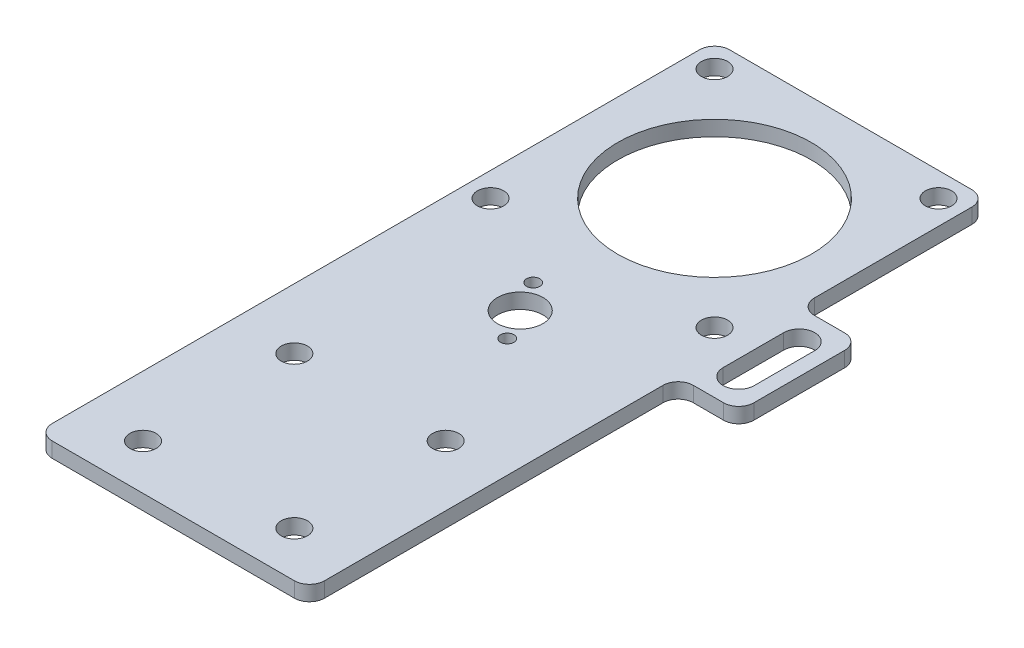
ISO-10303-21;
HEADER;
FILE_DESCRIPTION(('STEP AP214'),'2;1');
FILE_NAME('part.step','',(''),(''),'','','');
FILE_SCHEMA(('AUTOMOTIVE_DESIGN { 1 0 10303 214 1 1 1 1 }'));
ENDSEC;
DATA;
#1=APPLICATION_CONTEXT('core data for automotive mechanical design processes');
#2=APPLICATION_PROTOCOL_DEFINITION('international standard','automotive_design',2000,#1);
#3=PRODUCT_CONTEXT('',#1,'mechanical');
#4=PRODUCT('Part','Part','',(#3));
#5=PRODUCT_RELATED_PRODUCT_CATEGORY('part','',(#4));
#6=PRODUCT_DEFINITION_FORMATION('','',#4);
#7=PRODUCT_DEFINITION_CONTEXT('part definition',#1,'design');
#8=PRODUCT_DEFINITION('design','',#6,#7);
#9=PRODUCT_DEFINITION_SHAPE('','',#8);
#10=(LENGTH_UNIT() NAMED_UNIT(*) SI_UNIT(.MILLI.,.METRE.));
#11=(NAMED_UNIT(*) PLANE_ANGLE_UNIT() SI_UNIT($,.RADIAN.));
#12=(NAMED_UNIT(*) SI_UNIT($,.STERADIAN.) SOLID_ANGLE_UNIT());
#13=UNCERTAINTY_MEASURE_WITH_UNIT(LENGTH_MEASURE(1.E-05),#10,'distance_accuracy_value','');
#14=(GEOMETRIC_REPRESENTATION_CONTEXT(3) GLOBAL_UNCERTAINTY_ASSIGNED_CONTEXT((#13)) GLOBAL_UNIT_ASSIGNED_CONTEXT((#10,
#11,#12)) REPRESENTATION_CONTEXT('',''));
#15=CARTESIAN_POINT('',(0.,0.,0.));
#16=DIRECTION('',(0.,0.,1.));
#17=DIRECTION('',(1.,0.,0.));
#18=AXIS2_PLACEMENT_3D('',#15,#16,#17);
#19=CARTESIAN_POINT('',(28.575,-3.17500000000005,-25.1681958439345));
#20=DIRECTION('',(-1.,0.,0.));
#21=DIRECTION('',(0.,1.,0.));
#22=AXIS2_PLACEMENT_3D('',#19,#20,#21);
#23=PLANE('',#22);
#24=DIRECTION('',(0.,0.,-1.));
#25=VECTOR('',#24,1.);
#26=CARTESIAN_POINT('',(28.575,0.,-25.1681958439345));
#27=LINE('',#26,#25);
#28=CARTESIAN_POINT('',(28.575,-6.38378239159465E-13,-110.393195843935));
#29=VERTEX_POINT('',#28);
#30=CARTESIAN_POINT('',(28.575,-4.09394740330526E-13,-77.3681958439346));
#31=VERTEX_POINT('',#30);
#32=EDGE_CURVE('E215',#29,#31,#27,.F.);
#33=ORIENTED_EDGE('',*,*,#32,.T.);
#34=DIRECTION('',(0.,1.,0.));
#35=VECTOR('',#34,1.);
#36=CARTESIAN_POINT('',(28.575,-3.17500000000041,-77.3681958439345));
#37=LINE('',#36,#35);
#38=CARTESIAN_POINT('',(28.575,-3.17500000000041,-77.3681958439345));
#39=VERTEX_POINT('',#38);
#40=EDGE_CURVE('E490',#31,#39,#37,.F.);
#41=ORIENTED_EDGE('',*,*,#40,.T.);
#42=DIRECTION('',(0.,0.,1.));
#43=VECTOR('',#42,1.);
#44=CARTESIAN_POINT('',(28.575,-3.17500000000005,-25.1681958439344));
#45=LINE('',#44,#43);
#46=CARTESIAN_POINT('',(28.575,-3.17500000000064,-110.393195843935));
#47=VERTEX_POINT('',#46);
#48=EDGE_CURVE('E426',#47,#39,#45,.T.);
#49=ORIENTED_EDGE('',*,*,#48,.F.);
#50=DIRECTION('',(0.,1.,0.));
#51=VECTOR('',#50,1.);
#52=CARTESIAN_POINT('',(28.575,-3.17500000000064,-110.393195843935));
#53=LINE('',#52,#51);
#54=EDGE_CURVE('E486',#47,#29,#53,.T.);
#55=ORIENTED_EDGE('',*,*,#54,.T.);
#56=EDGE_LOOP('',(#33,#41,#49,#55));
#57=FACE_BOUND('',#56,.T.);
#58=ADVANCED_FACE('F65',(#57),#23,.F.);
#59=CARTESIAN_POINT('',(28.575,-3.17500000000018,-45.6181958439346));
#60=VERTEX_POINT('',#59);
#61=CARTESIAN_POINT('',(28.575,-3.175,25.4));
#62=VERTEX_POINT('',#61);
#63=EDGE_CURVE('E429',#60,#62,#45,.T.);
#64=ORIENTED_EDGE('',*,*,#63,.F.);
#65=DIRECTION('',(0.,1.,0.));
#66=VECTOR('',#65,1.);
#67=CARTESIAN_POINT('',(28.575,-3.17500000000019,-45.6181958439346));
#68=LINE('',#67,#66);
#69=CARTESIAN_POINT('',(28.575,-1.87350135405495E-13,-45.6181958439346));
#70=VERTEX_POINT('',#69);
#71=EDGE_CURVE('E212',#60,#70,#68,.T.);
#72=ORIENTED_EDGE('',*,*,#71,.T.);
#73=CARTESIAN_POINT('',(28.575,0.,25.4));
#74=VERTEX_POINT('',#73);
#75=EDGE_CURVE('E204',#70,#74,#27,.F.);
#76=ORIENTED_EDGE('',*,*,#75,.T.);
#77=DIRECTION('',(0.,1.,0.));
#78=VECTOR('',#77,1.);
#79=CARTESIAN_POINT('',(28.575,-3.175,25.4));
#80=LINE('',#79,#78);
#81=EDGE_CURVE('E209',#74,#62,#80,.F.);
#82=ORIENTED_EDGE('',*,*,#81,.T.);
#83=EDGE_LOOP('',(#64,#72,#76,#82));
#84=FACE_BOUND('',#83,.T.);
#85=ADVANCED_FACE('F207',(#84),#23,.F.);
#86=CARTESIAN_POINT('',(-28.575,-3.17500000000064,-113.568195843935));
#87=DIRECTION('',(1.,0.,0.));
#88=DIRECTION('',(0.,-1.,0.));
#89=AXIS2_PLACEMENT_3D('',#86,#87,#88);
#90=PLANE('',#89);
#91=DIRECTION('',(0.,0.,1.));
#92=VECTOR('',#91,1.);
#93=CARTESIAN_POINT('',(-28.575,-6.45317133063372E-13,-113.568195843935));
#94=LINE('',#93,#92);
#95=CARTESIAN_POINT('',(-28.575,0.,25.4));
#96=VERTEX_POINT('',#95);
#97=CARTESIAN_POINT('',(-28.575,-6.24500451351651E-13,-110.393195843935));
#98=VERTEX_POINT('',#97);
#99=EDGE_CURVE('E434',#96,#98,#94,.F.);
#100=ORIENTED_EDGE('',*,*,#99,.T.);
#101=DIRECTION('',(0.,1.,0.));
#102=VECTOR('',#101,1.);
#103=CARTESIAN_POINT('',(-28.575,-3.17500000000062,-110.393195843935));
#104=LINE('',#103,#102);
#105=CARTESIAN_POINT('',(-28.575,-3.17500000000062,-110.393195843935));
#106=VERTEX_POINT('',#105);
#107=EDGE_CURVE('E500',#98,#106,#104,.F.);
#108=ORIENTED_EDGE('',*,*,#107,.T.);
#109=DIRECTION('',(0.,0.,-1.));
#110=VECTOR('',#109,1.);
#111=CARTESIAN_POINT('',(-28.575,-3.17500000000003,-25.1681958439344));
#112=LINE('',#111,#110);
#113=CARTESIAN_POINT('',(-28.575,-3.175,25.4));
#114=VERTEX_POINT('',#113);
#115=EDGE_CURVE('E422',#114,#106,#112,.T.);
#116=ORIENTED_EDGE('',*,*,#115,.F.);
#117=DIRECTION('',(0.,1.,0.));
#118=VECTOR('',#117,1.);
#119=CARTESIAN_POINT('',(-28.575,-3.175,25.4));
#120=LINE('',#119,#118);
#121=EDGE_CURVE('E228',#114,#96,#120,.T.);
#122=ORIENTED_EDGE('',*,*,#121,.T.);
#123=EDGE_LOOP('',(#100,#108,#116,#122));
#124=FACE_BOUND('',#123,.T.);
#125=ADVANCED_FACE('F560',(#124),#90,.F.);
#126=CARTESIAN_POINT('',(0.,-3.17500000000004,-25.1681958439344));
#127=DIRECTION('',(0.,1.,0.));
#128=DIRECTION('',(0.,0.,1.));
#129=AXIS2_PLACEMENT_3D('',#126,#127,#128);
#130=PLANE('',#129);
#131=DIRECTION('',(0.,0.,1.));
#132=VECTOR('',#131,1.);
#133=CARTESIAN_POINT('',(31.6611,-3.17500000000241,-55.1431958439346));
#134=LINE('',#133,#132);
#135=CARTESIAN_POINT('',(31.6611,-3.1750000000025,-67.8431958439345));
#136=VERTEX_POINT('',#135);
#137=CARTESIAN_POINT('',(31.6611,-3.17500000000241,-55.1431958439346));
#138=VERTEX_POINT('',#137);
#139=EDGE_CURVE('E302',#136,#138,#134,.T.);
#140=ORIENTED_EDGE('',*,*,#139,.T.);
#141=CARTESIAN_POINT('',(34.925,-3.17500000000241,-55.1431958439346));
#142=DIRECTION('',(0.,1.,0.));
#143=DIRECTION('',(0.,0.,1.));
#144=AXIS2_PLACEMENT_3D('',#141,#142,#143);
#145=CIRCLE('',#144,3.2639);
#146=CARTESIAN_POINT('',(38.1889,-3.17500000000241,-55.1431958439346));
#147=VERTEX_POINT('',#146);
#148=EDGE_CURVE('E289',#138,#147,#145,.T.);
#149=ORIENTED_EDGE('',*,*,#148,.T.);
#150=DIRECTION('',(0.,0.,-1.));
#151=VECTOR('',#150,1.);
#152=CARTESIAN_POINT('',(38.1889,-3.17500000000241,-55.1431958439346));
#153=LINE('',#152,#151);
#154=CARTESIAN_POINT('',(38.1889,-3.17500000000034,-67.8431958439346));
#155=VERTEX_POINT('',#154);
#156=EDGE_CURVE('E293',#147,#155,#153,.T.);
#157=ORIENTED_EDGE('',*,*,#156,.T.);
#158=CARTESIAN_POINT('',(34.925,-3.1750000000025,-67.8431958439345));
#159=DIRECTION('',(0.,1.,0.));
#160=DIRECTION('',(0.,0.,1.));
#161=AXIS2_PLACEMENT_3D('',#158,#159,#160);
#162=CIRCLE('',#161,3.2639);
#163=EDGE_CURVE('E298',#155,#136,#162,.T.);
#164=ORIENTED_EDGE('',*,*,#163,.T.);
#165=EDGE_LOOP('',(#140,#149,#157,#164));
#166=FACE_BOUND('',#165,.T.);
#167=CARTESIAN_POINT('',(-3.72110000000003,-3.17500000000021,-50.663330103979));
#168=DIRECTION('',(0.,1.,0.));
#169=DIRECTION('',(0.,0.,1.));
#170=AXIS2_PLACEMENT_3D('',#167,#168,#169);
#171=CIRCLE('',#170,1.397);
#172=CARTESIAN_POINT('',(-3.72110000000003,-3.1750000000002,-49.266330103979));
#173=VERTEX_POINT('',#172);
#174=EDGE_CURVE('E359',#173,#173,#171,.T.);
#175=ORIENTED_EDGE('',*,*,#174,.T.);
#176=EDGE_LOOP('',(#175));
#177=FACE_BOUND('',#176,.T.);
#178=CARTESIAN_POINT('',(3.72109999999999,-3.17500000000013,-37.7730615838899));
#179=DIRECTION('',(0.,1.,0.));
#180=DIRECTION('',(0.,0.,1.));
#181=AXIS2_PLACEMENT_3D('',#178,#179,#180);
#182=CIRCLE('',#181,1.397);
#183=CARTESIAN_POINT('',(3.72109999999999,-3.17500000000012,-36.3760615838899));
#184=VERTEX_POINT('',#183);
#185=EDGE_CURVE('E367',#184,#184,#182,.T.);
#186=ORIENTED_EDGE('',*,*,#185,.T.);
#187=EDGE_LOOP('',(#186));
#188=FACE_BOUND('',#187,.T.);
#189=CARTESIAN_POINT('',(0.,-3.17500000000184,-44.2181958439344));
#190=DIRECTION('',(0.,1.,0.));
#191=DIRECTION('',(0.,0.,1.));
#192=AXIS2_PLACEMENT_3D('',#189,#190,#191);
#193=CIRCLE('',#192,4.7625);
#194=CARTESIAN_POINT('',(0.,-3.17500000000181,-39.4556958439344));
#195=VERTEX_POINT('',#194);
#196=EDGE_CURVE('E372',#195,#195,#193,.T.);
#197=ORIENTED_EDGE('',*,*,#196,.T.);
#198=EDGE_LOOP('',(#197));
#199=FACE_BOUND('',#198,.T.);
#200=CARTESIAN_POINT('',(23.5,-3.17500000000062,-108.493195843935));
#201=DIRECTION('',(0.,1.,0.));
#202=DIRECTION('',(0.,0.,1.));
#203=AXIS2_PLACEMENT_3D('',#200,#201,#202);
#204=CIRCLE('',#203,2.75);
#205=CARTESIAN_POINT('',(23.5,-3.1750000000006,-105.743195843935));
#206=VERTEX_POINT('',#205);
#207=EDGE_CURVE('E383',#206,#206,#204,.T.);
#208=ORIENTED_EDGE('',*,*,#207,.T.);
#209=EDGE_LOOP('',(#208));
#210=FACE_BOUND('',#209,.T.);
#211=CARTESIAN_POINT('',(23.5,-3.17500000000029,-61.4931958439346));
#212=DIRECTION('',(0.,1.,0.));
#213=DIRECTION('',(0.,0.,1.));
#214=AXIS2_PLACEMENT_3D('',#211,#212,#213);
#215=CIRCLE('',#214,2.75);
#216=CARTESIAN_POINT('',(23.5,-3.17500000000027,-58.7431958439345));
#217=VERTEX_POINT('',#216);
#218=EDGE_CURVE('E391',#217,#217,#215,.T.);
#219=ORIENTED_EDGE('',*,*,#218,.T.);
#220=EDGE_LOOP('',(#219));
#221=FACE_BOUND('',#220,.T.);
#222=CARTESIAN_POINT('',(-23.5,-3.17500000000028,-61.4931958439345));
#223=DIRECTION('',(0.,1.,0.));
#224=DIRECTION('',(0.,0.,1.));
#225=AXIS2_PLACEMENT_3D('',#222,#223,#224);
#226=CIRCLE('',#225,2.75);
#227=CARTESIAN_POINT('',(-23.5,-3.17500000000026,-58.7431958439345));
#228=VERTEX_POINT('',#227);
#229=EDGE_CURVE('E399',#228,#228,#226,.T.);
#230=ORIENTED_EDGE('',*,*,#229,.T.);
#231=EDGE_LOOP('',(#230));
#232=FACE_BOUND('',#231,.T.);
#233=CARTESIAN_POINT('',(-23.5,-3.17500000000061,-108.493195843935));
#234=DIRECTION('',(0.,1.,0.));
#235=DIRECTION('',(0.,0.,1.));
#236=AXIS2_PLACEMENT_3D('',#233,#234,#235);
#237=CIRCLE('',#236,2.75);
#238=CARTESIAN_POINT('',(-23.5,-3.17500000000059,-105.743195843935));
#239=VERTEX_POINT('',#238);
#240=EDGE_CURVE('E407',#239,#239,#237,.T.);
#241=ORIENTED_EDGE('',*,*,#240,.T.);
#242=EDGE_LOOP('',(#241));
#243=FACE_BOUND('',#242,.T.);
#244=CARTESIAN_POINT('',(0.,-3.17500000000146,-84.9931958439345));
#245=DIRECTION('',(0.,1.,0.));
#246=DIRECTION('',(0.,0.,1.));
#247=AXIS2_PLACEMENT_3D('',#244,#245,#246);
#248=CIRCLE('',#247,20.32);
#249=CARTESIAN_POINT('',(0.,-3.17500000000132,-64.6731958439345));
#250=VERTEX_POINT('',#249);
#251=EDGE_CURVE('E216',#250,#250,#248,.T.);
#252=ORIENTED_EDGE('',*,*,#251,.T.);
#253=EDGE_LOOP('',(#252));
#254=FACE_BOUND('',#253,.T.);
#255=DIRECTION('',(0.,0.,-1.));
#256=VECTOR('',#255,1.);
#257=CARTESIAN_POINT('',(41.275,-3.17500000000053,-74.1931958439345));
#258=LINE('',#257,#256);
#259=CARTESIAN_POINT('',(41.275,-3.17500000000038,-51.9681958439345));
#260=VERTEX_POINT('',#259);
#261=CARTESIAN_POINT('',(41.275,-3.17500000000051,-71.0181958439345));
#262=VERTEX_POINT('',#261);
#263=EDGE_CURVE('E338',#260,#262,#258,.T.);
#264=ORIENTED_EDGE('',*,*,#263,.F.);
#265=CARTESIAN_POINT('',(38.1,-3.17500000000023,-51.9681958439345));
#266=DIRECTION('',(0.,1.,0.));
#267=DIRECTION('',(0.,0.,1.));
#268=AXIS2_PLACEMENT_3D('',#265,#266,#267);
#269=CIRCLE('',#268,3.175);
#270=CARTESIAN_POINT('',(38.1,-3.17500000000036,-48.7931958439345));
#271=VERTEX_POINT('',#270);
#272=EDGE_CURVE('E477',#260,#271,#269,.F.);
#273=ORIENTED_EDGE('',*,*,#272,.T.);
#274=DIRECTION('',(1.,0.,0.));
#275=VECTOR('',#274,1.);
#276=CARTESIAN_POINT('',(28.575,-3.17500000000035,-48.7931958439345));
#277=LINE('',#276,#275);
#278=CARTESIAN_POINT('',(31.75,-3.17500000000035,-48.7931958439345));
#279=VERTEX_POINT('',#278);
#280=EDGE_CURVE('E334',#279,#271,#277,.T.);
#281=ORIENTED_EDGE('',*,*,#280,.F.);
#282=CARTESIAN_POINT('',(31.75,-3.17500000000018,-45.6181958439346));
#283=DIRECTION('',(0.,1.,0.));
#284=DIRECTION('',(0.,0.,1.));
#285=AXIS2_PLACEMENT_3D('',#282,#283,#284);
#286=CIRCLE('',#285,3.175);
#287=EDGE_CURVE('E506',#279,#60,#286,.T.);
#288=ORIENTED_EDGE('',*,*,#287,.T.);
#289=ORIENTED_EDGE('',*,*,#63,.T.);
#290=CARTESIAN_POINT('',(25.4,-3.175,25.4));
#291=DIRECTION('',(0.,-1.,0.));
#292=DIRECTION('',(0.,0.,-1.));
#293=AXIS2_PLACEMENT_3D('',#290,#291,#292);
#294=CIRCLE('',#293,3.175);
#295=CARTESIAN_POINT('',(25.4,-3.175,28.575));
#296=VERTEX_POINT('',#295);
#297=EDGE_CURVE('E231',#62,#296,#294,.T.);
#298=ORIENTED_EDGE('',*,*,#297,.T.);
#299=DIRECTION('',(1.,0.,0.));
#300=VECTOR('',#299,1.);
#301=CARTESIAN_POINT('',(-28.575,-3.175,28.575));
#302=LINE('',#301,#300);
#303=CARTESIAN_POINT('',(-25.4,-3.175,28.575));
#304=VERTEX_POINT('',#303);
#305=EDGE_CURVE('E282',#304,#296,#302,.T.);
#306=ORIENTED_EDGE('',*,*,#305,.F.);
#307=CARTESIAN_POINT('',(-25.4,-3.175,25.4));
#308=DIRECTION('',(0.,-1.,0.));
#309=DIRECTION('',(0.,0.,-1.));
#310=AXIS2_PLACEMENT_3D('',#307,#308,#309);
#311=CIRCLE('',#310,3.175);
#312=EDGE_CURVE('E241',#304,#114,#311,.T.);
#313=ORIENTED_EDGE('',*,*,#312,.T.);
#314=ORIENTED_EDGE('',*,*,#115,.T.);
#315=CARTESIAN_POINT('',(-25.4,-3.17500000000062,-110.393195843935));
#316=DIRECTION('',(0.,1.,0.));
#317=DIRECTION('',(0.,0.,1.));
#318=AXIS2_PLACEMENT_3D('',#315,#316,#317);
#319=CIRCLE('',#318,3.175);
#320=CARTESIAN_POINT('',(-25.4,-3.17500000000064,-113.568195843935));
#321=VERTEX_POINT('',#320);
#322=EDGE_CURVE('E468',#106,#321,#319,.F.);
#323=ORIENTED_EDGE('',*,*,#322,.T.);
#324=DIRECTION('',(1.,0.,0.));
#325=VECTOR('',#324,1.);
#326=CARTESIAN_POINT('',(0.,-3.17500000000065,-113.568195843935));
#327=LINE('',#326,#325);
#328=CARTESIAN_POINT('',(25.4,-3.17500000000066,-113.568195843935));
#329=VERTEX_POINT('',#328);
#330=EDGE_CURVE('E418',#321,#329,#327,.T.);
#331=ORIENTED_EDGE('',*,*,#330,.T.);
#332=CARTESIAN_POINT('',(25.4,-3.17500000000064,-110.393195843935));
#333=DIRECTION('',(0.,1.,0.));
#334=DIRECTION('',(0.,0.,1.));
#335=AXIS2_PLACEMENT_3D('',#332,#333,#334);
#336=CIRCLE('',#335,3.175);
#337=EDGE_CURVE('E471',#329,#47,#336,.F.);
#338=ORIENTED_EDGE('',*,*,#337,.T.);
#339=ORIENTED_EDGE('',*,*,#48,.T.);
#340=CARTESIAN_POINT('',(31.75,-3.17500000000041,-77.3681958439345));
#341=DIRECTION('',(0.,1.,0.));
#342=DIRECTION('',(0.,0.,1.));
#343=AXIS2_PLACEMENT_3D('',#340,#341,#342);
#344=CIRCLE('',#343,3.175);
#345=CARTESIAN_POINT('',(31.75,-3.17500000000053,-74.1931958439345));
#346=VERTEX_POINT('',#345);
#347=EDGE_CURVE('E13',#39,#346,#344,.T.);
#348=ORIENTED_EDGE('',*,*,#347,.T.);
#349=DIRECTION('',(-1.,0.,0.));
#350=VECTOR('',#349,1.);
#351=CARTESIAN_POINT('',(28.575,-3.17500000000053,-74.1931958439345));
#352=LINE('',#351,#350);
#353=CARTESIAN_POINT('',(38.1,-3.17500000000053,-74.1931958439345));
#354=VERTEX_POINT('',#353);
#355=EDGE_CURVE('E343',#354,#346,#352,.T.);
#356=ORIENTED_EDGE('',*,*,#355,.F.);
#357=CARTESIAN_POINT('',(38.1,-3.17500000000036,-71.0181958439345));
#358=DIRECTION('',(0.,1.,0.));
#359=DIRECTION('',(0.,0.,1.));
#360=AXIS2_PLACEMENT_3D('',#357,#358,#359);
#361=CIRCLE('',#360,3.175);
#362=EDGE_CURVE('E474',#354,#262,#361,.F.);
#363=ORIENTED_EDGE('',*,*,#362,.T.);
#364=EDGE_LOOP('',(#264,#273,#281,#288,#289,#298,#306,#313,#314,#323,#331,#338,#339,#348,#356,#363));
#365=FACE_BOUND('',#364,.T.);
#366=CARTESIAN_POINT('',(15.875,-3.175,-12.7));
#367=DIRECTION('',(0.,-1.,0.));
#368=DIRECTION('',(0.,0.,-1.));
#369=AXIS2_PLACEMENT_3D('',#366,#367,#368);
#370=CIRCLE('',#369,2.75);
#371=CARTESIAN_POINT('',(15.875,-3.175,-15.45));
#372=VERTEX_POINT('',#371);
#373=EDGE_CURVE('E252',#372,#372,#370,.T.);
#374=ORIENTED_EDGE('',*,*,#373,.F.);
#375=EDGE_LOOP('',(#374));
#376=FACE_BOUND('',#375,.T.);
#377=CARTESIAN_POINT('',(-15.875,-3.175,-12.7));
#378=DIRECTION('',(0.,-1.,0.));
#379=DIRECTION('',(0.,0.,-1.));
#380=AXIS2_PLACEMENT_3D('',#377,#378,#379);
#381=CIRCLE('',#380,2.75);
#382=CARTESIAN_POINT('',(-15.875,-3.175,-15.45));
#383=VERTEX_POINT('',#382);
#384=EDGE_CURVE('E260',#383,#383,#381,.T.);
#385=ORIENTED_EDGE('',*,*,#384,.F.);
#386=EDGE_LOOP('',(#385));
#387=FACE_BOUND('',#386,.T.);
#388=CARTESIAN_POINT('',(-15.875,-3.175,19.05));
#389=DIRECTION('',(0.,-1.,0.));
#390=DIRECTION('',(0.,0.,-1.));
#391=AXIS2_PLACEMENT_3D('',#388,#389,#390);
#392=CIRCLE('',#391,2.75);
#393=CARTESIAN_POINT('',(-15.875,-3.175,16.3));
#394=VERTEX_POINT('',#393);
#395=EDGE_CURVE('E268',#394,#394,#392,.T.);
#396=ORIENTED_EDGE('',*,*,#395,.F.);
#397=EDGE_LOOP('',(#396));
#398=FACE_BOUND('',#397,.T.);
#399=CARTESIAN_POINT('',(15.875,-3.175,19.05));
#400=DIRECTION('',(0.,-1.,0.));
#401=DIRECTION('',(0.,0.,-1.));
#402=AXIS2_PLACEMENT_3D('',#399,#400,#401);
#403=CIRCLE('',#402,2.75);
#404=CARTESIAN_POINT('',(15.875,-3.175,16.3));
#405=VERTEX_POINT('',#404);
#406=EDGE_CURVE('E276',#405,#405,#403,.T.);
#407=ORIENTED_EDGE('',*,*,#406,.F.);
#408=EDGE_LOOP('',(#407));
#409=FACE_BOUND('',#408,.T.);
#410=ADVANCED_FACE('F521',(#166,#177,#188,#199,#210,#221,#232,#243,#254,#365,#376,#387,#398,
#409),#130,.F.);
#411=CARTESIAN_POINT('',(0.,0.,0.));
#412=DIRECTION('',(0.,-1.,0.));
#413=DIRECTION('',(0.,0.,-1.));
#414=AXIS2_PLACEMENT_3D('',#411,#412,#413);
#415=PLANE('',#414);
#416=CARTESIAN_POINT('',(34.925,-3.98986399474666E-13,-55.1431958439346));
#417=DIRECTION('',(0.,1.,0.));
#418=DIRECTION('',(0.,0.,1.));
#419=AXIS2_PLACEMENT_3D('',#416,#417,#418);
#420=CIRCLE('',#419,3.2639);
#421=CARTESIAN_POINT('',(31.6611,-3.98986399474666E-13,-55.1431958439346));
#422=VERTEX_POINT('',#421);
#423=CARTESIAN_POINT('',(38.1889,-2.56739074444567E-13,-55.1431958439346));
#424=VERTEX_POINT('',#423);
#425=EDGE_CURVE('E307',#422,#424,#420,.T.);
#426=ORIENTED_EDGE('',*,*,#425,.F.);
#427=DIRECTION('',(0.,0.,1.));
#428=VECTOR('',#427,1.);
#429=CARTESIAN_POINT('',(31.6611,-3.98986399474666E-13,-55.1431958439346));
#430=LINE('',#429,#428);
#431=CARTESIAN_POINT('',(31.6611,-4.8919202022546E-13,-67.8431958439346));
#432=VERTEX_POINT('',#431);
#433=EDGE_CURVE('E294',#432,#422,#430,.T.);
#434=ORIENTED_EDGE('',*,*,#433,.F.);
#435=CARTESIAN_POINT('',(34.925,-4.8919202022546E-13,-67.8431958439346));
#436=DIRECTION('',(0.,1.,0.));
#437=DIRECTION('',(0.,0.,1.));
#438=AXIS2_PLACEMENT_3D('',#435,#436,#437);
#439=CIRCLE('',#438,3.2639);
#440=CARTESIAN_POINT('',(38.1889,-4.92661467177413E-13,-67.8431958439346));
#441=VERTEX_POINT('',#440);
#442=EDGE_CURVE('E314',#441,#432,#439,.T.);
#443=ORIENTED_EDGE('',*,*,#442,.F.);
#444=DIRECTION('',(0.,0.,-1.));
#445=VECTOR('',#444,1.);
#446=CARTESIAN_POINT('',(38.1889,-4.02455846426619E-13,-55.1431958439346));
#447=LINE('',#446,#445);
#448=EDGE_CURVE('E310',#424,#441,#447,.T.);
#449=ORIENTED_EDGE('',*,*,#448,.F.);
#450=EDGE_LOOP('',(#426,#434,#443,#449));
#451=FACE_BOUND('',#450,.T.);
#452=CARTESIAN_POINT('',(-3.72110000000003,-3.60822483003176E-13,-50.663330103979));
#453=DIRECTION('',(0.,1.,0.));
#454=DIRECTION('',(0.,0.,1.));
#455=AXIS2_PLACEMENT_3D('',#452,#453,#454);
#456=CIRCLE('',#455,1.397);
#457=CARTESIAN_POINT('',(-3.72110000000003,-3.50981742563528E-13,-49.266330103979));
#458=VERTEX_POINT('',#457);
#459=EDGE_CURVE('E346',#458,#458,#456,.T.);
#460=ORIENTED_EDGE('',*,*,#459,.F.);
#461=EDGE_LOOP('',(#460));
#462=FACE_BOUND('',#461,.T.);
#463=CARTESIAN_POINT('',(3.72109999999999,-2.70616862252382E-13,-37.7730615838899));
#464=DIRECTION('',(0.,1.,0.));
#465=DIRECTION('',(0.,0.,1.));
#466=AXIS2_PLACEMENT_3D('',#463,#464,#465);
#467=CIRCLE('',#466,1.397);
#468=CARTESIAN_POINT('',(3.72109999999999,-2.60776121812734E-13,-36.3760615838899));
#469=VERTEX_POINT('',#468);
#470=EDGE_CURVE('E363',#469,#469,#467,.T.);
#471=ORIENTED_EDGE('',*,*,#470,.F.);
#472=EDGE_LOOP('',(#471));
#473=FACE_BOUND('',#472,.T.);
#474=CARTESIAN_POINT('',(0.,-3.12250225675825E-13,-44.2181958439345));
#475=DIRECTION('',(0.,1.,0.));
#476=DIRECTION('',(0.,0.,1.));
#477=AXIS2_PLACEMENT_3D('',#474,#475,#476);
#478=CIRCLE('',#477,4.7625);
#479=CARTESIAN_POINT('',(0.,-2.78702246904297E-13,-39.4556958439344));
#480=VERTEX_POINT('',#479);
#481=EDGE_CURVE('E371',#480,#480,#478,.T.);
#482=ORIENTED_EDGE('',*,*,#481,.F.);
#483=EDGE_LOOP('',(#482));
#484=FACE_BOUND('',#483,.T.);
#485=CARTESIAN_POINT('',(23.5,-7.70217223333702E-13,-108.493195843935));
#486=DIRECTION('',(0.,1.,0.));
#487=DIRECTION('',(0.,0.,1.));
#488=AXIS2_PLACEMENT_3D('',#485,#486,#487);
#489=CIRCLE('',#488,2.75);
#490=CARTESIAN_POINT('',(23.5,-7.50845687035182E-13,-105.743195843935));
#491=VERTEX_POINT('',#490);
#492=EDGE_CURVE('E376',#491,#491,#489,.T.);
#493=ORIENTED_EDGE('',*,*,#492,.F.);
#494=EDGE_LOOP('',(#493));
#495=FACE_BOUND('',#494,.T.);
#496=CARTESIAN_POINT('',(23.5,-4.40619762898109E-13,-61.4931958439346));
#497=DIRECTION('',(0.,1.,0.));
#498=DIRECTION('',(0.,0.,1.));
#499=AXIS2_PLACEMENT_3D('',#496,#497,#498);
#500=CIRCLE('',#499,2.75);
#501=CARTESIAN_POINT('',(23.5,-4.21248226599589E-13,-58.7431958439346));
#502=VERTEX_POINT('',#501);
#503=EDGE_CURVE('E387',#502,#502,#500,.T.);
#504=ORIENTED_EDGE('',*,*,#503,.F.);
#505=EDGE_LOOP('',(#504));
#506=FACE_BOUND('',#505,.T.);
#507=CARTESIAN_POINT('',(-23.5,-4.30211422042248E-13,-61.4931958439346));
#508=DIRECTION('',(0.,1.,0.));
#509=DIRECTION('',(0.,0.,1.));
#510=AXIS2_PLACEMENT_3D('',#507,#508,#509);
#511=CIRCLE('',#510,2.75);
#512=CARTESIAN_POINT('',(-23.5,-4.10839885743728E-13,-58.7431958439346));
#513=VERTEX_POINT('',#512);
#514=EDGE_CURVE('E395',#513,#513,#511,.T.);
#515=ORIENTED_EDGE('',*,*,#514,.F.);
#516=EDGE_LOOP('',(#515));
#517=FACE_BOUND('',#516,.T.);
#518=CARTESIAN_POINT('',(-23.5,-7.59808882477842E-13,-108.493195843935));
#519=DIRECTION('',(0.,1.,0.));
#520=DIRECTION('',(0.,0.,1.));
#521=AXIS2_PLACEMENT_3D('',#518,#519,#520);
#522=CIRCLE('',#521,2.75);
#523=CARTESIAN_POINT('',(-23.5,-7.40437346179322E-13,-105.743195843935));
#524=VERTEX_POINT('',#523);
#525=EDGE_CURVE('E403',#524,#524,#522,.T.);
#526=ORIENTED_EDGE('',*,*,#525,.F.);
#527=EDGE_LOOP('',(#526));
#528=FACE_BOUND('',#527,.T.);
#529=CARTESIAN_POINT('',(0.,-6.00214322687975E-13,-84.9931958439346));
#530=DIRECTION('',(0.,1.,0.));
#531=DIRECTION('',(0.,0.,1.));
#532=AXIS2_PLACEMENT_3D('',#529,#530,#531);
#533=CIRCLE('',#532,20.32);
#534=CARTESIAN_POINT('',(0.,-4.57076279929457E-13,-64.6731958439346));
#535=VERTEX_POINT('',#534);
#536=EDGE_CURVE('E411',#535,#535,#533,.T.);
#537=ORIENTED_EDGE('',*,*,#536,.F.);
#538=EDGE_LOOP('',(#537));
#539=FACE_BOUND('',#538,.T.);
#540=DIRECTION('',(1.,0.,0.));
#541=VECTOR('',#540,1.);
#542=CARTESIAN_POINT('',(28.575,-3.53883589099269E-13,-48.7931958439346));
#543=LINE('',#542,#541);
#544=CARTESIAN_POINT('',(31.75,-3.53883589099269E-13,-48.7931958439346));
#545=VERTEX_POINT('',#544);
#546=CARTESIAN_POINT('',(38.1,-3.57353036051222E-13,-48.7931958439346));
#547=VERTEX_POINT('',#546);
#548=EDGE_CURVE('E324',#545,#547,#543,.T.);
#549=ORIENTED_EDGE('',*,*,#548,.T.);
#550=CARTESIAN_POINT('',(38.1,-2.35922392732846E-13,-51.9681958439346));
#551=DIRECTION('',(0.,1.,0.));
#552=DIRECTION('',(0.,0.,1.));
#553=AXIS2_PLACEMENT_3D('',#550,#551,#552);
#554=CIRCLE('',#553,3.175);
#555=CARTESIAN_POINT('',(41.275,-3.78169717762944E-13,-51.9681958439346));
#556=VERTEX_POINT('',#555);
#557=EDGE_CURVE('E458',#547,#556,#554,.T.);
#558=ORIENTED_EDGE('',*,*,#557,.T.);
#559=DIRECTION('',(0.,0.,-1.));
#560=VECTOR('',#559,1.);
#561=CARTESIAN_POINT('',(41.275,-5.34294830600857E-13,-74.1931958439345));
#562=LINE('',#561,#560);
#563=CARTESIAN_POINT('',(41.275,-5.13478148889135E-13,-71.0181958439346));
#564=VERTEX_POINT('',#563);
#565=EDGE_CURVE('E349',#556,#564,#562,.T.);
#566=ORIENTED_EDGE('',*,*,#565,.T.);
#567=CARTESIAN_POINT('',(38.1,-3.67761376907083E-13,-71.0181958439346));
#568=DIRECTION('',(0.,1.,0.));
#569=DIRECTION('',(0.,0.,1.));
#570=AXIS2_PLACEMENT_3D('',#567,#568,#569);
#571=CIRCLE('',#570,3.175);
#572=CARTESIAN_POINT('',(38.1,-5.34294830600857E-13,-74.1931958439345));
#573=VERTEX_POINT('',#572);
#574=EDGE_CURVE('E455',#564,#573,#571,.T.);
#575=ORIENTED_EDGE('',*,*,#574,.T.);
#576=DIRECTION('',(-1.,0.,0.));
#577=VECTOR('',#576,1.);
#578=CARTESIAN_POINT('',(28.575,-5.34294830600857E-13,-74.1931958439345));
#579=LINE('',#578,#577);
#580=CARTESIAN_POINT('',(31.75,-5.34294830600857E-13,-74.1931958439345));
#581=VERTEX_POINT('',#580);
#582=EDGE_CURVE('E339',#573,#581,#579,.T.);
#583=ORIENTED_EDGE('',*,*,#582,.T.);
#584=CARTESIAN_POINT('',(31.75,-4.09394740330526E-13,-77.3681958439346));
#585=DIRECTION('',(0.,1.,0.));
#586=DIRECTION('',(0.,0.,1.));
#587=AXIS2_PLACEMENT_3D('',#584,#585,#586);
#588=CIRCLE('',#587,3.175);
#589=EDGE_CURVE('E74',#581,#31,#588,.F.);
#590=ORIENTED_EDGE('',*,*,#589,.T.);
#591=ORIENTED_EDGE('',*,*,#32,.F.);
#592=CARTESIAN_POINT('',(25.4,-6.38378239159465E-13,-110.393195843935));
#593=DIRECTION('',(0.,1.,0.));
#594=DIRECTION('',(0.,0.,1.));
#595=AXIS2_PLACEMENT_3D('',#592,#593,#594);
#596=CIRCLE('',#595,3.175);
#597=CARTESIAN_POINT('',(25.4,-6.6266436782314E-13,-113.568195843935));
#598=VERTEX_POINT('',#597);
#599=EDGE_CURVE('E452',#29,#598,#596,.T.);
#600=ORIENTED_EDGE('',*,*,#599,.T.);
#601=DIRECTION('',(-1.,0.,0.));
#602=VECTOR('',#601,1.);
#603=CARTESIAN_POINT('',(28.575,-6.66133814775094E-13,-113.568195843935));
#604=LINE('',#603,#602);
#605=CARTESIAN_POINT('',(-25.4,-6.48786580015326E-13,-113.568195843935));
#606=VERTEX_POINT('',#605);
#607=EDGE_CURVE('E430',#606,#598,#604,.F.);
#608=ORIENTED_EDGE('',*,*,#607,.F.);
#609=CARTESIAN_POINT('',(-25.4,-6.24500451351651E-13,-110.393195843935));
#610=DIRECTION('',(0.,1.,0.));
#611=DIRECTION('',(0.,0.,1.));
#612=AXIS2_PLACEMENT_3D('',#609,#610,#611);
#613=CIRCLE('',#612,3.175);
#614=EDGE_CURVE('E449',#606,#98,#613,.T.);
#615=ORIENTED_EDGE('',*,*,#614,.T.);
#616=ORIENTED_EDGE('',*,*,#99,.F.);
#617=CARTESIAN_POINT('',(-25.4,0.,25.4));
#618=DIRECTION('',(0.,-1.,0.));
#619=DIRECTION('',(0.,0.,-1.));
#620=AXIS2_PLACEMENT_3D('',#617,#618,#619);
#621=CIRCLE('',#620,3.175);
#622=CARTESIAN_POINT('',(-25.4,0.,28.575));
#623=VERTEX_POINT('',#622);
#624=EDGE_CURVE('E233',#96,#623,#621,.F.);
#625=ORIENTED_EDGE('',*,*,#624,.T.);
#626=DIRECTION('',(1.,0.,0.));
#627=VECTOR('',#626,1.);
#628=CARTESIAN_POINT('',(-28.575,0.,28.575));
#629=LINE('',#628,#627);
#630=CARTESIAN_POINT('',(25.4,0.,28.575));
#631=VERTEX_POINT('',#630);
#632=EDGE_CURVE('E223',#623,#631,#629,.T.);
#633=ORIENTED_EDGE('',*,*,#632,.T.);
#634=CARTESIAN_POINT('',(25.4,0.,25.4));
#635=DIRECTION('',(0.,-1.,0.));
#636=DIRECTION('',(0.,0.,-1.));
#637=AXIS2_PLACEMENT_3D('',#634,#635,#636);
#638=CIRCLE('',#637,3.175);
#639=EDGE_CURVE('E219',#631,#74,#638,.F.);
#640=ORIENTED_EDGE('',*,*,#639,.T.);
#641=ORIENTED_EDGE('',*,*,#75,.F.);
#642=CARTESIAN_POINT('',(31.75,-1.87350135405495E-13,-45.6181958439346));
#643=DIRECTION('',(0.,1.,0.));
#644=DIRECTION('',(0.,0.,1.));
#645=AXIS2_PLACEMENT_3D('',#642,#643,#644);
#646=CIRCLE('',#645,3.175);
#647=EDGE_CURVE('E503',#70,#545,#646,.F.);
#648=ORIENTED_EDGE('',*,*,#647,.T.);
#649=EDGE_LOOP('',(#549,#558,#566,#575,#583,#590,#591,#600,#608,#615,#616,#625,#633,#640,#641,#648));
#650=FACE_BOUND('',#649,.T.);
#651=CARTESIAN_POINT('',(15.875,0.,-12.7));
#652=DIRECTION('',(0.,1.,0.));
#653=DIRECTION('',(0.,0.,1.));
#654=AXIS2_PLACEMENT_3D('',#651,#652,#653);
#655=CIRCLE('',#654,2.75);
#656=CARTESIAN_POINT('',(15.875,0.,-9.95000000000001));
#657=VERTEX_POINT('',#656);
#658=EDGE_CURVE('E248',#657,#657,#655,.T.);
#659=ORIENTED_EDGE('',*,*,#658,.F.);
#660=EDGE_LOOP('',(#659));
#661=FACE_BOUND('',#660,.T.);
#662=CARTESIAN_POINT('',(-15.875,0.,-12.7));
#663=DIRECTION('',(0.,1.,0.));
#664=DIRECTION('',(0.,0.,1.));
#665=AXIS2_PLACEMENT_3D('',#662,#663,#664);
#666=CIRCLE('',#665,2.75);
#667=CARTESIAN_POINT('',(-15.875,0.,-9.95000000000003));
#668=VERTEX_POINT('',#667);
#669=EDGE_CURVE('E256',#668,#668,#666,.T.);
#670=ORIENTED_EDGE('',*,*,#669,.F.);
#671=EDGE_LOOP('',(#670));
#672=FACE_BOUND('',#671,.T.);
#673=CARTESIAN_POINT('',(-15.875,0.,19.05));
#674=DIRECTION('',(0.,1.,0.));
#675=DIRECTION('',(0.,0.,1.));
#676=AXIS2_PLACEMENT_3D('',#673,#674,#675);
#677=CIRCLE('',#676,2.75);
#678=CARTESIAN_POINT('',(-15.875,0.,21.8));
#679=VERTEX_POINT('',#678);
#680=EDGE_CURVE('E264',#679,#679,#677,.T.);
#681=ORIENTED_EDGE('',*,*,#680,.F.);
#682=EDGE_LOOP('',(#681));
#683=FACE_BOUND('',#682,.T.);
#684=CARTESIAN_POINT('',(15.875,0.,19.05));
#685=DIRECTION('',(0.,1.,0.));
#686=DIRECTION('',(0.,0.,1.));
#687=AXIS2_PLACEMENT_3D('',#684,#685,#686);
#688=CIRCLE('',#687,2.75);
#689=CARTESIAN_POINT('',(15.875,0.,21.8));
#690=VERTEX_POINT('',#689);
#691=EDGE_CURVE('E272',#690,#690,#688,.T.);
#692=ORIENTED_EDGE('',*,*,#691,.F.);
#693=EDGE_LOOP('',(#692));
#694=FACE_BOUND('',#693,.T.);
#695=ADVANCED_FACE('F67',(#451,#462,#473,#484,#495,#506,#517,#528,#539,#650,#661,#672,#683,
#694),#415,.F.);
#696=CARTESIAN_POINT('',(28.575,-3.17500000000066,-113.568195843935));
#697=DIRECTION('',(0.,0.,1.));
#698=DIRECTION('',(0.,-1.,0.));
#699=AXIS2_PLACEMENT_3D('',#696,#697,#698);
#700=PLANE('',#699);
#701=ORIENTED_EDGE('',*,*,#607,.T.);
#702=DIRECTION('',(0.,1.,0.));
#703=VECTOR('',#702,1.);
#704=CARTESIAN_POINT('',(25.4,-3.17500000000066,-113.568195843935));
#705=LINE('',#704,#703);
#706=EDGE_CURVE('E497',#598,#329,#705,.F.);
#707=ORIENTED_EDGE('',*,*,#706,.T.);
#708=ORIENTED_EDGE('',*,*,#330,.F.);
#709=DIRECTION('',(0.,1.,0.));
#710=VECTOR('',#709,1.);
#711=CARTESIAN_POINT('',(-25.4,-3.17500000000065,-113.568195843935));
#712=LINE('',#711,#710);
#713=EDGE_CURVE('E493',#321,#606,#712,.T.);
#714=ORIENTED_EDGE('',*,*,#713,.T.);
#715=EDGE_LOOP('',(#701,#707,#708,#714));
#716=FACE_BOUND('',#715,.T.);
#717=ADVANCED_FACE('F565',(#716),#700,.F.);
#718=CARTESIAN_POINT('',(0.,-3.17500000000146,-84.9931958439345));
#719=DIRECTION('',(0.,1.,0.));
#720=DIRECTION('',(0.,0.,1.));
#721=AXIS2_PLACEMENT_3D('',#718,#719,#720);
#722=CYLINDRICAL_SURFACE('',#721,20.32);
#723=ORIENTED_EDGE('',*,*,#251,.F.);
#724=EDGE_LOOP('',(#723));
#725=FACE_BOUND('',#724,.T.);
#726=ORIENTED_EDGE('',*,*,#536,.T.);
#727=EDGE_LOOP('',(#726));
#728=FACE_BOUND('',#727,.T.);
#729=ADVANCED_FACE('F568',(#725,#728),#722,.F.);
#730=CARTESIAN_POINT('',(-23.5,-7.59808882477842E-13,-108.493195843935));
#731=DIRECTION('',(0.,1.,0.));
#732=DIRECTION('',(0.,0.,1.));
#733=AXIS2_PLACEMENT_3D('',#730,#731,#732);
#734=CYLINDRICAL_SURFACE('',#733,2.75);
#735=ORIENTED_EDGE('',*,*,#525,.T.);
#736=EDGE_LOOP('',(#735));
#737=FACE_BOUND('',#736,.T.);
#738=ORIENTED_EDGE('',*,*,#240,.F.);
#739=EDGE_LOOP('',(#738));
#740=FACE_BOUND('',#739,.T.);
#741=ADVANCED_FACE('F575',(#737,#740),#734,.F.);
#742=CARTESIAN_POINT('',(-23.5,-4.30211422042248E-13,-61.4931958439346));
#743=DIRECTION('',(0.,1.,0.));
#744=DIRECTION('',(0.,0.,1.));
#745=AXIS2_PLACEMENT_3D('',#742,#743,#744);
#746=CYLINDRICAL_SURFACE('',#745,2.75);
#747=ORIENTED_EDGE('',*,*,#514,.T.);
#748=EDGE_LOOP('',(#747));
#749=FACE_BOUND('',#748,.T.);
#750=ORIENTED_EDGE('',*,*,#229,.F.);
#751=EDGE_LOOP('',(#750));
#752=FACE_BOUND('',#751,.T.);
#753=ADVANCED_FACE('F579',(#749,#752),#746,.F.);
#754=CARTESIAN_POINT('',(23.5,-4.40619762898109E-13,-61.4931958439346));
#755=DIRECTION('',(0.,1.,0.));
#756=DIRECTION('',(0.,0.,1.));
#757=AXIS2_PLACEMENT_3D('',#754,#755,#756);
#758=CYLINDRICAL_SURFACE('',#757,2.75);
#759=ORIENTED_EDGE('',*,*,#503,.T.);
#760=EDGE_LOOP('',(#759));
#761=FACE_BOUND('',#760,.T.);
#762=ORIENTED_EDGE('',*,*,#218,.F.);
#763=EDGE_LOOP('',(#762));
#764=FACE_BOUND('',#763,.T.);
#765=ADVANCED_FACE('F583',(#761,#764),#758,.F.);
#766=CARTESIAN_POINT('',(23.5,-7.70217223333702E-13,-108.493195843935));
#767=DIRECTION('',(0.,1.,0.));
#768=DIRECTION('',(0.,0.,1.));
#769=AXIS2_PLACEMENT_3D('',#766,#767,#768);
#770=CYLINDRICAL_SURFACE('',#769,2.75);
#771=ORIENTED_EDGE('',*,*,#492,.T.);
#772=EDGE_LOOP('',(#771));
#773=FACE_BOUND('',#772,.T.);
#774=ORIENTED_EDGE('',*,*,#207,.F.);
#775=EDGE_LOOP('',(#774));
#776=FACE_BOUND('',#775,.T.);
#777=ADVANCED_FACE('F587',(#773,#776),#770,.F.);
#778=CARTESIAN_POINT('',(0.,-3.17500000000184,-44.2181958439344));
#779=DIRECTION('',(0.,1.,0.));
#780=DIRECTION('',(0.,0.,1.));
#781=AXIS2_PLACEMENT_3D('',#778,#779,#780);
#782=CYLINDRICAL_SURFACE('',#781,4.7625);
#783=ORIENTED_EDGE('',*,*,#196,.F.);
#784=EDGE_LOOP('',(#783));
#785=FACE_BOUND('',#784,.T.);
#786=ORIENTED_EDGE('',*,*,#481,.T.);
#787=EDGE_LOOP('',(#786));
#788=FACE_BOUND('',#787,.T.);
#789=ADVANCED_FACE('F591',(#785,#788),#782,.F.);
#790=CARTESIAN_POINT('',(3.72109999999999,-2.70616862252382E-13,-37.7730615838899));
#791=DIRECTION('',(0.,1.,0.));
#792=DIRECTION('',(0.,0.,1.));
#793=AXIS2_PLACEMENT_3D('',#790,#791,#792);
#794=CYLINDRICAL_SURFACE('',#793,1.397);
#795=ORIENTED_EDGE('',*,*,#470,.T.);
#796=EDGE_LOOP('',(#795));
#797=FACE_BOUND('',#796,.T.);
#798=ORIENTED_EDGE('',*,*,#185,.F.);
#799=EDGE_LOOP('',(#798));
#800=FACE_BOUND('',#799,.T.);
#801=ADVANCED_FACE('F595',(#797,#800),#794,.F.);
#802=CARTESIAN_POINT('',(-3.72110000000003,-3.60822483003176E-13,-50.663330103979));
#803=DIRECTION('',(0.,1.,0.));
#804=DIRECTION('',(0.,0.,1.));
#805=AXIS2_PLACEMENT_3D('',#802,#803,#804);
#806=CYLINDRICAL_SURFACE('',#805,1.397);
#807=ORIENTED_EDGE('',*,*,#459,.T.);
#808=EDGE_LOOP('',(#807));
#809=FACE_BOUND('',#808,.T.);
#810=ORIENTED_EDGE('',*,*,#174,.F.);
#811=EDGE_LOOP('',(#810));
#812=FACE_BOUND('',#811,.T.);
#813=ADVANCED_FACE('F599',(#809,#812),#806,.F.);
#814=CARTESIAN_POINT('',(28.575,-3.17500000000053,-74.1931958439345));
#815=DIRECTION('',(0.,0.,-1.));
#816=DIRECTION('',(0.,1.,0.));
#817=AXIS2_PLACEMENT_3D('',#814,#815,#816);
#818=PLANE('',#817);
#819=ORIENTED_EDGE('',*,*,#582,.F.);
#820=DIRECTION('',(0.,1.,0.));
#821=VECTOR('',#820,1.);
#822=CARTESIAN_POINT('',(38.1,-3.17500000000053,-74.1931958439345));
#823=LINE('',#822,#821);
#824=EDGE_CURVE('E86',#573,#354,#823,.F.);
#825=ORIENTED_EDGE('',*,*,#824,.T.);
#826=ORIENTED_EDGE('',*,*,#355,.T.);
#827=DIRECTION('',(0.,1.,0.));
#828=VECTOR('',#827,1.);
#829=CARTESIAN_POINT('',(31.75,-3.17500000000053,-74.1931958439345));
#830=LINE('',#829,#828);
#831=EDGE_CURVE('E480',#346,#581,#830,.T.);
#832=ORIENTED_EDGE('',*,*,#831,.T.);
#833=EDGE_LOOP('',(#819,#825,#826,#832));
#834=FACE_BOUND('',#833,.T.);
#835=ADVANCED_FACE('F518',(#834),#818,.T.);
#836=CARTESIAN_POINT('',(41.275,-3.17500000000053,-74.1931958439345));
#837=DIRECTION('',(1.,0.,0.));
#838=DIRECTION('',(0.,0.,-1.));
#839=AXIS2_PLACEMENT_3D('',#836,#837,#838);
#840=PLANE('',#839);
#841=ORIENTED_EDGE('',*,*,#565,.F.);
#842=DIRECTION('',(0.,1.,0.));
#843=VECTOR('',#842,1.);
#844=CARTESIAN_POINT('',(41.275,-3.17500000000038,-51.9681958439345));
#845=LINE('',#844,#843);
#846=EDGE_CURVE('E465',#556,#260,#845,.F.);
#847=ORIENTED_EDGE('',*,*,#846,.T.);
#848=ORIENTED_EDGE('',*,*,#263,.T.);
#849=DIRECTION('',(0.,1.,0.));
#850=VECTOR('',#849,1.);
#851=CARTESIAN_POINT('',(41.275,-3.17500000000051,-71.0181958439345));
#852=LINE('',#851,#850);
#853=EDGE_CURVE('E461',#262,#564,#852,.T.);
#854=ORIENTED_EDGE('',*,*,#853,.T.);
#855=EDGE_LOOP('',(#841,#847,#848,#854));
#856=FACE_BOUND('',#855,.T.);
#857=ADVANCED_FACE('F528',(#856),#840,.T.);
#858=CARTESIAN_POINT('',(28.575,-3.17500000000035,-48.7931958439345));
#859=DIRECTION('',(0.,0.,1.));
#860=DIRECTION('',(0.,-1.,0.));
#861=AXIS2_PLACEMENT_3D('',#858,#859,#860);
#862=PLANE('',#861);
#863=ORIENTED_EDGE('',*,*,#548,.F.);
#864=DIRECTION('',(0.,1.,0.));
#865=VECTOR('',#864,1.);
#866=CARTESIAN_POINT('',(31.75,-3.17500000000035,-48.7931958439345));
#867=LINE('',#866,#865);
#868=EDGE_CURVE('E446',#545,#279,#867,.F.);
#869=ORIENTED_EDGE('',*,*,#868,.T.);
#870=ORIENTED_EDGE('',*,*,#280,.T.);
#871=DIRECTION('',(0.,1.,0.));
#872=VECTOR('',#871,1.);
#873=CARTESIAN_POINT('',(38.1,-3.17500000000036,-48.7931958439345));
#874=LINE('',#873,#872);
#875=EDGE_CURVE('E442',#271,#547,#874,.T.);
#876=ORIENTED_EDGE('',*,*,#875,.T.);
#877=EDGE_LOOP('',(#863,#869,#870,#876));
#878=FACE_BOUND('',#877,.T.);
#879=ADVANCED_FACE('F536',(#878),#862,.T.);
#880=CARTESIAN_POINT('',(34.925,-3.17500000000241,-55.1431958439346));
#881=DIRECTION('',(0.,1.,0.));
#882=DIRECTION('',(0.,0.,1.));
#883=AXIS2_PLACEMENT_3D('',#880,#881,#882);
#884=CYLINDRICAL_SURFACE('',#883,3.2639);
#885=ORIENTED_EDGE('',*,*,#425,.T.);
#886=DIRECTION('',(0.,1.,0.));
#887=VECTOR('',#886,1.);
#888=CARTESIAN_POINT('',(38.1889,-3.17500000000241,-55.1431958439346));
#889=LINE('',#888,#887);
#890=EDGE_CURVE('E306',#147,#424,#889,.T.);
#891=ORIENTED_EDGE('',*,*,#890,.F.);
#892=ORIENTED_EDGE('',*,*,#148,.F.);
#893=DIRECTION('',(0.,1.,0.));
#894=VECTOR('',#893,1.);
#895=CARTESIAN_POINT('',(31.6611,-3.17500000000241,-55.1431958439346));
#896=LINE('',#895,#894);
#897=EDGE_CURVE('E321',#138,#422,#896,.T.);
#898=ORIENTED_EDGE('',*,*,#897,.T.);
#899=EDGE_LOOP('',(#885,#891,#892,#898));
#900=FACE_BOUND('',#899,.T.);
#901=ADVANCED_FACE('F606',(#900),#884,.F.);
#902=CARTESIAN_POINT('',(31.6611,-3.17500000000241,-55.1431958439346));
#903=DIRECTION('',(-1.,0.,0.));
#904=DIRECTION('',(0.,-1.,0.));
#905=AXIS2_PLACEMENT_3D('',#902,#903,#904);
#906=PLANE('',#905);
#907=ORIENTED_EDGE('',*,*,#433,.T.);
#908=ORIENTED_EDGE('',*,*,#897,.F.);
#909=ORIENTED_EDGE('',*,*,#139,.F.);
#910=DIRECTION('',(0.,1.,0.));
#911=VECTOR('',#910,1.);
#912=CARTESIAN_POINT('',(31.6611,-3.1750000000025,-67.8431958439345));
#913=LINE('',#912,#911);
#914=EDGE_CURVE('E325',#136,#432,#913,.T.);
#915=ORIENTED_EDGE('',*,*,#914,.T.);
#916=EDGE_LOOP('',(#907,#908,#909,#915));
#917=FACE_BOUND('',#916,.T.);
#918=ADVANCED_FACE('F612',(#917),#906,.F.);
#919=CARTESIAN_POINT('',(34.925,-3.1750000000025,-67.8431958439345));
#920=DIRECTION('',(0.,1.,0.));
#921=DIRECTION('',(0.,0.,1.));
#922=AXIS2_PLACEMENT_3D('',#919,#920,#921);
#923=CYLINDRICAL_SURFACE('',#922,3.2639);
#924=ORIENTED_EDGE('',*,*,#442,.T.);
#925=ORIENTED_EDGE('',*,*,#914,.F.);
#926=ORIENTED_EDGE('',*,*,#163,.F.);
#927=DIRECTION('',(0.,1.,0.));
#928=VECTOR('',#927,1.);
#929=CARTESIAN_POINT('',(38.1889,-3.1750000000025,-67.8431958439346));
#930=LINE('',#929,#928);
#931=EDGE_CURVE('E328',#155,#441,#930,.T.);
#932=ORIENTED_EDGE('',*,*,#931,.T.);
#933=EDGE_LOOP('',(#924,#925,#926,#932));
#934=FACE_BOUND('',#933,.T.);
#935=ADVANCED_FACE('F550',(#934),#923,.F.);
#936=CARTESIAN_POINT('',(38.1889,-3.17500000000241,-55.1431958439346));
#937=DIRECTION('',(1.,0.,0.));
#938=DIRECTION('',(0.,1.,0.));
#939=AXIS2_PLACEMENT_3D('',#936,#937,#938);
#940=PLANE('',#939);
#941=ORIENTED_EDGE('',*,*,#448,.T.);
#942=ORIENTED_EDGE('',*,*,#931,.F.);
#943=ORIENTED_EDGE('',*,*,#156,.F.);
#944=ORIENTED_EDGE('',*,*,#890,.T.);
#945=EDGE_LOOP('',(#941,#942,#943,#944));
#946=FACE_BOUND('',#945,.T.);
#947=ADVANCED_FACE('F543',(#946),#940,.F.);
#948=CARTESIAN_POINT('',(31.75,-3.17500000000019,-45.6181958439346));
#949=DIRECTION('',(0.,1.,0.));
#950=DIRECTION('',(0.,0.,1.));
#951=AXIS2_PLACEMENT_3D('',#948,#949,#950);
#952=CYLINDRICAL_SURFACE('',#951,3.175);
#953=ORIENTED_EDGE('',*,*,#287,.F.);
#954=ORIENTED_EDGE('',*,*,#868,.F.);
#955=ORIENTED_EDGE('',*,*,#647,.F.);
#956=ORIENTED_EDGE('',*,*,#71,.F.);
#957=EDGE_LOOP('',(#953,#954,#955,#956));
#958=FACE_BOUND('',#957,.T.);
#959=ADVANCED_FACE('F541',(#958),#952,.F.);
#960=CARTESIAN_POINT('',(38.1,-3.17500000000038,-51.9681958439345));
#961=DIRECTION('',(0.,1.,0.));
#962=DIRECTION('',(0.,0.,1.));
#963=AXIS2_PLACEMENT_3D('',#960,#961,#962);
#964=CYLINDRICAL_SURFACE('',#963,3.175);
#965=ORIENTED_EDGE('',*,*,#272,.F.);
#966=ORIENTED_EDGE('',*,*,#846,.F.);
#967=ORIENTED_EDGE('',*,*,#557,.F.);
#968=ORIENTED_EDGE('',*,*,#875,.F.);
#969=EDGE_LOOP('',(#965,#966,#967,#968));
#970=FACE_BOUND('',#969,.T.);
#971=ADVANCED_FACE('F534',(#970),#964,.T.);
#972=CARTESIAN_POINT('',(38.1,-3.17500000000051,-71.0181958439345));
#973=DIRECTION('',(0.,1.,0.));
#974=DIRECTION('',(0.,0.,1.));
#975=AXIS2_PLACEMENT_3D('',#972,#973,#974);
#976=CYLINDRICAL_SURFACE('',#975,3.175);
#977=ORIENTED_EDGE('',*,*,#362,.F.);
#978=ORIENTED_EDGE('',*,*,#824,.F.);
#979=ORIENTED_EDGE('',*,*,#574,.F.);
#980=ORIENTED_EDGE('',*,*,#853,.F.);
#981=EDGE_LOOP('',(#977,#978,#979,#980));
#982=FACE_BOUND('',#981,.T.);
#983=ADVANCED_FACE('F525',(#982),#976,.T.);
#984=CARTESIAN_POINT('',(31.75,-3.17500000000056,-77.3681958439345));
#985=DIRECTION('',(0.,1.,0.));
#986=DIRECTION('',(0.,0.,1.));
#987=AXIS2_PLACEMENT_3D('',#984,#985,#986);
#988=CYLINDRICAL_SURFACE('',#987,3.175);
#989=ORIENTED_EDGE('',*,*,#347,.F.);
#990=ORIENTED_EDGE('',*,*,#40,.F.);
#991=ORIENTED_EDGE('',*,*,#589,.F.);
#992=ORIENTED_EDGE('',*,*,#831,.F.);
#993=EDGE_LOOP('',(#989,#990,#991,#992));
#994=FACE_BOUND('',#993,.T.);
#995=ADVANCED_FACE('F517',(#994),#988,.F.);
#996=CARTESIAN_POINT('',(25.4,-3.17500000000064,-110.393195843935));
#997=DIRECTION('',(0.,1.,0.));
#998=DIRECTION('',(0.,0.,1.));
#999=AXIS2_PLACEMENT_3D('',#996,#997,#998);
#1000=CYLINDRICAL_SURFACE('',#999,3.175);
#1001=ORIENTED_EDGE('',*,*,#337,.F.);
#1002=ORIENTED_EDGE('',*,*,#706,.F.);
#1003=ORIENTED_EDGE('',*,*,#599,.F.);
#1004=ORIENTED_EDGE('',*,*,#54,.F.);
#1005=EDGE_LOOP('',(#1001,#1002,#1003,#1004));
#1006=FACE_BOUND('',#1005,.T.);
#1007=ADVANCED_FACE('F650',(#1006),#1000,.T.);
#1008=CARTESIAN_POINT('',(-25.4,-3.17500000000063,-110.393195843935));
#1009=DIRECTION('',(0.,1.,0.));
#1010=DIRECTION('',(0.,0.,1.));
#1011=AXIS2_PLACEMENT_3D('',#1008,#1009,#1010);
#1012=CYLINDRICAL_SURFACE('',#1011,3.175);
#1013=ORIENTED_EDGE('',*,*,#322,.F.);
#1014=ORIENTED_EDGE('',*,*,#107,.F.);
#1015=ORIENTED_EDGE('',*,*,#614,.F.);
#1016=ORIENTED_EDGE('',*,*,#713,.F.);
#1017=EDGE_LOOP('',(#1013,#1014,#1015,#1016));
#1018=FACE_BOUND('',#1017,.T.);
#1019=ADVANCED_FACE('F646',(#1018),#1012,.T.);
#1020=CARTESIAN_POINT('',(25.4,-3.175,25.4));
#1021=DIRECTION('',(0.,1.,0.));
#1022=DIRECTION('',(0.,0.,1.));
#1023=AXIS2_PLACEMENT_3D('',#1020,#1021,#1022);
#1024=CYLINDRICAL_SURFACE('',#1023,3.175);
#1025=ORIENTED_EDGE('',*,*,#297,.F.);
#1026=ORIENTED_EDGE('',*,*,#81,.F.);
#1027=ORIENTED_EDGE('',*,*,#639,.F.);
#1028=DIRECTION('',(0.,1.,0.));
#1029=VECTOR('',#1028,1.);
#1030=CARTESIAN_POINT('',(25.4,-3.175,28.575));
#1031=LINE('',#1030,#1029);
#1032=EDGE_CURVE('E280',#296,#631,#1031,.T.);
#1033=ORIENTED_EDGE('',*,*,#1032,.F.);
#1034=EDGE_LOOP('',(#1025,#1026,#1027,#1033));
#1035=FACE_BOUND('',#1034,.T.);
#1036=ADVANCED_FACE('F230',(#1035),#1024,.T.);
#1037=CARTESIAN_POINT('',(-25.4,-3.175,25.4));
#1038=DIRECTION('',(0.,1.,0.));
#1039=DIRECTION('',(0.,0.,1.));
#1040=AXIS2_PLACEMENT_3D('',#1037,#1038,#1039);
#1041=CYLINDRICAL_SURFACE('',#1040,3.175);
#1042=ORIENTED_EDGE('',*,*,#312,.F.);
#1043=DIRECTION('',(0.,1.,0.));
#1044=VECTOR('',#1043,1.);
#1045=CARTESIAN_POINT('',(-25.4,-3.175,28.575));
#1046=LINE('',#1045,#1044);
#1047=EDGE_CURVE('E286',#623,#304,#1046,.F.);
#1048=ORIENTED_EDGE('',*,*,#1047,.F.);
#1049=ORIENTED_EDGE('',*,*,#624,.F.);
#1050=ORIENTED_EDGE('',*,*,#121,.F.);
#1051=EDGE_LOOP('',(#1042,#1048,#1049,#1050));
#1052=FACE_BOUND('',#1051,.T.);
#1053=ADVANCED_FACE('F640',(#1052),#1041,.T.);
#1054=CARTESIAN_POINT('',(-28.575,-3.175,28.575));
#1055=DIRECTION('',(0.,0.,1.));
#1056=DIRECTION('',(1.,0.,0.));
#1057=AXIS2_PLACEMENT_3D('',#1054,#1055,#1056);
#1058=PLANE('',#1057);
#1059=ORIENTED_EDGE('',*,*,#632,.F.);
#1060=ORIENTED_EDGE('',*,*,#1047,.T.);
#1061=ORIENTED_EDGE('',*,*,#305,.T.);
#1062=ORIENTED_EDGE('',*,*,#1032,.T.);
#1063=EDGE_LOOP('',(#1059,#1060,#1061,#1062));
#1064=FACE_BOUND('',#1063,.T.);
#1065=ADVANCED_FACE('F636',(#1064),#1058,.T.);
#1066=CARTESIAN_POINT('',(15.875,0.,19.05));
#1067=DIRECTION('',(0.,1.,0.));
#1068=DIRECTION('',(0.,0.,1.));
#1069=AXIS2_PLACEMENT_3D('',#1066,#1067,#1068);
#1070=CYLINDRICAL_SURFACE('',#1069,2.75);
#1071=ORIENTED_EDGE('',*,*,#406,.T.);
#1072=EDGE_LOOP('',(#1071));
#1073=FACE_BOUND('',#1072,.T.);
#1074=ORIENTED_EDGE('',*,*,#691,.T.);
#1075=EDGE_LOOP('',(#1074));
#1076=FACE_BOUND('',#1075,.T.);
#1077=ADVANCED_FACE('F632',(#1073,#1076),#1070,.F.);
#1078=CARTESIAN_POINT('',(-15.875,0.,19.05));
#1079=DIRECTION('',(0.,1.,0.));
#1080=DIRECTION('',(0.,0.,1.));
#1081=AXIS2_PLACEMENT_3D('',#1078,#1079,#1080);
#1082=CYLINDRICAL_SURFACE('',#1081,2.75);
#1083=ORIENTED_EDGE('',*,*,#395,.T.);
#1084=EDGE_LOOP('',(#1083));
#1085=FACE_BOUND('',#1084,.T.);
#1086=ORIENTED_EDGE('',*,*,#680,.T.);
#1087=EDGE_LOOP('',(#1086));
#1088=FACE_BOUND('',#1087,.T.);
#1089=ADVANCED_FACE('F628',(#1085,#1088),#1082,.F.);
#1090=CARTESIAN_POINT('',(-15.875,0.,-12.7));
#1091=DIRECTION('',(0.,1.,0.));
#1092=DIRECTION('',(0.,0.,1.));
#1093=AXIS2_PLACEMENT_3D('',#1090,#1091,#1092);
#1094=CYLINDRICAL_SURFACE('',#1093,2.75);
#1095=ORIENTED_EDGE('',*,*,#384,.T.);
#1096=EDGE_LOOP('',(#1095));
#1097=FACE_BOUND('',#1096,.T.);
#1098=ORIENTED_EDGE('',*,*,#669,.T.);
#1099=EDGE_LOOP('',(#1098));
#1100=FACE_BOUND('',#1099,.T.);
#1101=ADVANCED_FACE('F624',(#1097,#1100),#1094,.F.);
#1102=CARTESIAN_POINT('',(15.875,0.,-12.7));
#1103=DIRECTION('',(0.,1.,0.));
#1104=DIRECTION('',(0.,0.,1.));
#1105=AXIS2_PLACEMENT_3D('',#1102,#1103,#1104);
#1106=CYLINDRICAL_SURFACE('',#1105,2.75);
#1107=ORIENTED_EDGE('',*,*,#373,.T.);
#1108=EDGE_LOOP('',(#1107));
#1109=FACE_BOUND('',#1108,.T.);
#1110=ORIENTED_EDGE('',*,*,#658,.T.);
#1111=EDGE_LOOP('',(#1110));
#1112=FACE_BOUND('',#1111,.T.);
#1113=ADVANCED_FACE('F621',(#1109,#1112),#1106,.F.);
#1114=CLOSED_SHELL('',(#58,#85,#125,#410,#695,#717,#729,#741,#753,#765,#777,#789,#801,#813,#835,
#857,#879,#901,#918,#935,#947,#959,#971,#983,#995,#1007,#1019,#1036,#1053,#1065,#1077,#1089,
#1101,#1113));
#1115=MANIFOLD_SOLID_BREP('B2',#1114);
#1116=ADVANCED_BREP_SHAPE_REPRESENTATION('',(#18,#1115),#14);
#1117=SHAPE_DEFINITION_REPRESENTATION(#9,#1116);
ENDSEC;
END-ISO-10303-21;
